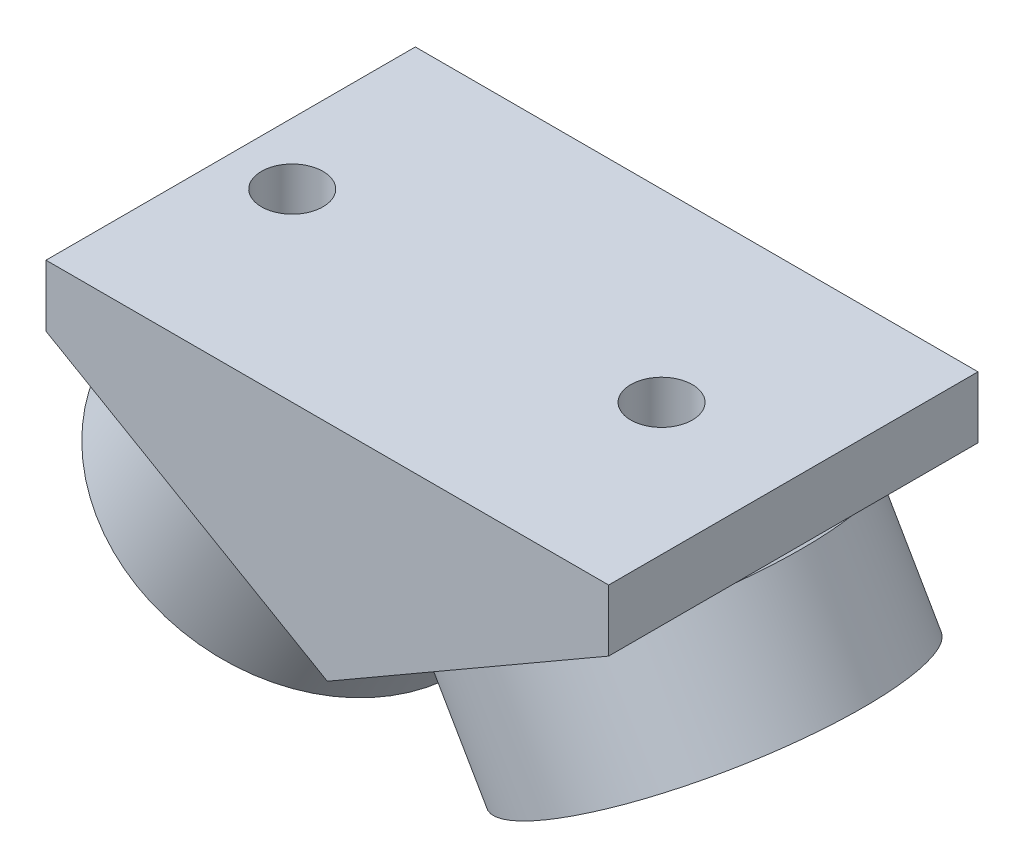
ISO-10303-21;
HEADER;
FILE_DESCRIPTION(('STEP AP214'),'2;1');
FILE_NAME('part.step','',(''),(''),'','','');
FILE_SCHEMA(('AUTOMOTIVE_DESIGN { 1 0 10303 214 1 1 1 1 }'));
ENDSEC;
DATA;
#1=APPLICATION_CONTEXT('core data for automotive mechanical design processes');
#2=APPLICATION_PROTOCOL_DEFINITION('international standard','automotive_design',2000,#1);
#3=PRODUCT_CONTEXT('',#1,'mechanical');
#4=PRODUCT('Part','Part','',(#3));
#5=PRODUCT_RELATED_PRODUCT_CATEGORY('part','',(#4));
#6=PRODUCT_DEFINITION_FORMATION('','',#4);
#7=PRODUCT_DEFINITION_CONTEXT('part definition',#1,'design');
#8=PRODUCT_DEFINITION('design','',#6,#7);
#9=PRODUCT_DEFINITION_SHAPE('','',#8);
#10=(LENGTH_UNIT() NAMED_UNIT(*) SI_UNIT(.MILLI.,.METRE.));
#11=(NAMED_UNIT(*) PLANE_ANGLE_UNIT() SI_UNIT($,.RADIAN.));
#12=(NAMED_UNIT(*) SI_UNIT($,.STERADIAN.) SOLID_ANGLE_UNIT());
#13=UNCERTAINTY_MEASURE_WITH_UNIT(LENGTH_MEASURE(1.E-05),#10,'distance_accuracy_value','');
#14=(GEOMETRIC_REPRESENTATION_CONTEXT(3) GLOBAL_UNCERTAINTY_ASSIGNED_CONTEXT((#13)) GLOBAL_UNIT_ASSIGNED_CONTEXT((#10,
#11,#12)) REPRESENTATION_CONTEXT('',''));
#15=CARTESIAN_POINT('',(0.,0.,0.));
#16=DIRECTION('',(0.,0.,1.));
#17=DIRECTION('',(1.,0.,0.));
#18=AXIS2_PLACEMENT_3D('',#15,#16,#17);
#19=CARTESIAN_POINT('',(0.,0.,38.1));
#20=DIRECTION('',(-0.500000000000003,0.866025403784437,0.));
#21=DIRECTION('',(-0.866025403784437,-0.500000000000003,0.));
#22=AXIS2_PLACEMENT_3D('',#19,#20,#21);
#23=PLANE('',#22);
#24=DIRECTION('',(0.,0.,-1.));
#25=VECTOR('',#24,1.);
#26=CARTESIAN_POINT('',(0.,0.,38.1));
#27=LINE('',#26,#25);
#28=CARTESIAN_POINT('',(0.,0.,38.1));
#29=VERTEX_POINT('',#28);
#30=CARTESIAN_POINT('',(0.,0.,24.9973690930889));
#31=VERTEX_POINT('',#30);
#32=EDGE_CURVE('E126',#29,#31,#27,.T.);
#33=ORIENTED_EDGE('',*,*,#32,.T.);
#34=CARTESIAN_POINT('',(14.5109579509048,8.3779054791543,19.05));
#35=DIRECTION('',(-0.500000000000003,0.866025403784437,0.));
#36=DIRECTION('',(-0.866025403784437,-0.500000000000003,0.));
#37=AXIS2_PLACEMENT_3D('',#34,#35,#36);
#38=CIRCLE('',#37,17.78);
#39=CARTESIAN_POINT('',(29.0219159018097,16.7558109583086,24.9973690930887));
#40=VERTEX_POINT('',#39);
#41=EDGE_CURVE('E185',#31,#40,#38,.T.);
#42=ORIENTED_EDGE('',*,*,#41,.T.);
#43=DIRECTION('',(0.,0.,-1.));
#44=VECTOR('',#43,1.);
#45=CARTESIAN_POINT('',(29.0219159018097,16.7558109583086,38.1));
#46=LINE('',#45,#44);
#47=CARTESIAN_POINT('',(29.0219159018097,16.7558109583086,38.1));
#48=VERTEX_POINT('',#47);
#49=EDGE_CURVE('E130',#48,#40,#46,.T.);
#50=ORIENTED_EDGE('',*,*,#49,.F.);
#51=DIRECTION('',(0.866025403784437,0.500000000000003,0.));
#52=VECTOR('',#51,1.);
#53=CARTESIAN_POINT('',(0.,0.,38.1));
#54=LINE('',#53,#52);
#55=EDGE_CURVE('E166',#29,#48,#54,.T.);
#56=ORIENTED_EDGE('',*,*,#55,.F.);
#57=EDGE_LOOP('',(#33,#42,#50,#56));
#58=FACE_BOUND('',#57,.T.);
#59=ADVANCED_FACE('F33',(#58),#23,.F.);
#60=CARTESIAN_POINT('',(-29.0219159018097,16.7558109583085,38.1));
#61=DIRECTION('',(0.500000000000001,0.866025403784438,0.));
#62=DIRECTION('',(-0.866025403784438,0.500000000000001,0.));
#63=AXIS2_PLACEMENT_3D('',#60,#61,#62);
#64=PLANE('',#63);
#65=CARTESIAN_POINT('',(-14.5109579509048,8.37790547915427,19.05));
#66=DIRECTION('',(-0.500000000000001,-0.866025403784438,0.));
#67=DIRECTION('',(0.866025403784438,-0.500000000000001,0.));
#68=AXIS2_PLACEMENT_3D('',#65,#66,#67);
#69=CIRCLE('',#68,17.78);
#70=CARTESIAN_POINT('',(-29.0219159018097,16.7558109583085,24.9973690930888));
#71=VERTEX_POINT('',#70);
#72=EDGE_CURVE('E170',#31,#71,#69,.T.);
#73=ORIENTED_EDGE('',*,*,#72,.F.);
#74=ORIENTED_EDGE('',*,*,#32,.F.);
#75=DIRECTION('',(0.866025403784438,-0.500000000000001,0.));
#76=VECTOR('',#75,1.);
#77=CARTESIAN_POINT('',(-29.0219159018097,16.7558109583085,38.1));
#78=LINE('',#77,#76);
#79=CARTESIAN_POINT('',(-29.0219159018097,16.7558109583085,38.1));
#80=VERTEX_POINT('',#79);
#81=EDGE_CURVE('E148',#80,#29,#78,.T.);
#82=ORIENTED_EDGE('',*,*,#81,.F.);
#83=DIRECTION('',(0.,0.,-1.));
#84=VECTOR('',#83,1.);
#85=CARTESIAN_POINT('',(-29.0219159018097,16.7558109583085,38.1));
#86=LINE('',#85,#84);
#87=EDGE_CURVE('E140',#80,#71,#86,.T.);
#88=ORIENTED_EDGE('',*,*,#87,.T.);
#89=EDGE_LOOP('',(#73,#74,#82,#88));
#90=FACE_BOUND('',#89,.T.);
#91=ADVANCED_FACE('F214',(#90),#64,.F.);
#92=CARTESIAN_POINT('',(-29.0219159018097,16.7558109583085,13.1026309069112));
#93=VERTEX_POINT('',#92);
#94=CARTESIAN_POINT('',(0.,0.,13.1026309069111));
#95=VERTEX_POINT('',#94);
#96=EDGE_CURVE('E56',#93,#95,#69,.T.);
#97=ORIENTED_EDGE('',*,*,#96,.F.);
#98=CARTESIAN_POINT('',(-29.0219159018097,16.7558109583085,0.));
#99=VERTEX_POINT('',#98);
#100=EDGE_CURVE('E144',#93,#99,#86,.T.);
#101=ORIENTED_EDGE('',*,*,#100,.T.);
#102=DIRECTION('',(0.866025403784438,-0.500000000000001,0.));
#103=VECTOR('',#102,1.);
#104=CARTESIAN_POINT('',(-29.0219159018097,16.7558109583085,0.));
#105=LINE('',#104,#103);
#106=CARTESIAN_POINT('',(0.,0.,0.));
#107=VERTEX_POINT('',#106);
#108=EDGE_CURVE('E156',#99,#107,#105,.T.);
#109=ORIENTED_EDGE('',*,*,#108,.T.);
#110=EDGE_CURVE('E129',#95,#107,#27,.T.);
#111=ORIENTED_EDGE('',*,*,#110,.F.);
#112=EDGE_LOOP('',(#97,#101,#109,#111));
#113=FACE_BOUND('',#112,.T.);
#114=ADVANCED_FACE('F35',(#113),#64,.F.);
#115=CARTESIAN_POINT('',(29.0219159018097,16.7558109583086,13.1026309069113));
#116=VERTEX_POINT('',#115);
#117=CARTESIAN_POINT('',(29.0219159018097,16.7558109583086,0.));
#118=VERTEX_POINT('',#117);
#119=EDGE_CURVE('E133',#116,#118,#46,.T.);
#120=ORIENTED_EDGE('',*,*,#119,.F.);
#121=EDGE_CURVE('E189',#116,#95,#38,.T.);
#122=ORIENTED_EDGE('',*,*,#121,.T.);
#123=ORIENTED_EDGE('',*,*,#110,.T.);
#124=DIRECTION('',(0.866025403784437,0.500000000000003,0.));
#125=VECTOR('',#124,1.);
#126=CARTESIAN_POINT('',(0.,0.,0.));
#127=LINE('',#126,#125);
#128=EDGE_CURVE('E153',#107,#118,#127,.T.);
#129=ORIENTED_EDGE('',*,*,#128,.T.);
#130=EDGE_LOOP('',(#120,#122,#123,#129));
#131=FACE_BOUND('',#130,.T.);
#132=ADVANCED_FACE('F117',(#131),#23,.F.);
#133=CARTESIAN_POINT('',(29.0219159018097,23.1058109583085,38.1));
#134=DIRECTION('',(-1.,0.,0.));
#135=DIRECTION('',(0.,-1.,0.));
#136=AXIS2_PLACEMENT_3D('',#133,#134,#135);
#137=PLANE('',#136);
#138=DIRECTION('',(0.,1.,0.));
#139=VECTOR('',#138,1.);
#140=CARTESIAN_POINT('',(29.0219159018097,23.1058109583085,0.));
#141=LINE('',#140,#139);
#142=CARTESIAN_POINT('',(29.0219159018097,23.1058109583085,0.));
#143=VERTEX_POINT('',#142);
#144=EDGE_CURVE('E151',#118,#143,#141,.T.);
#145=ORIENTED_EDGE('',*,*,#144,.T.);
#146=DIRECTION('',(0.,0.,-1.));
#147=VECTOR('',#146,1.);
#148=CARTESIAN_POINT('',(29.0219159018097,23.1058109583085,38.1));
#149=LINE('',#148,#147);
#150=CARTESIAN_POINT('',(29.0219159018097,23.1058109583085,38.1));
#151=VERTEX_POINT('',#150);
#152=EDGE_CURVE('E134',#151,#143,#149,.T.);
#153=ORIENTED_EDGE('',*,*,#152,.F.);
#154=DIRECTION('',(0.,1.,0.));
#155=VECTOR('',#154,1.);
#156=CARTESIAN_POINT('',(29.0219159018097,23.1058109583085,38.1));
#157=LINE('',#156,#155);
#158=EDGE_CURVE('E164',#48,#151,#157,.T.);
#159=ORIENTED_EDGE('',*,*,#158,.F.);
#160=ORIENTED_EDGE('',*,*,#49,.T.);
#161=DIRECTION('',(0.,0.,1.));
#162=VECTOR('',#161,1.);
#163=CARTESIAN_POINT('',(29.0219159018097,16.7558109583086,38.1));
#164=LINE('',#163,#162);
#165=EDGE_CURVE('E180',#116,#40,#164,.T.);
#166=ORIENTED_EDGE('',*,*,#165,.F.);
#167=ORIENTED_EDGE('',*,*,#119,.T.);
#168=EDGE_LOOP('',(#145,#153,#159,#160,#166,#167));
#169=FACE_BOUND('',#168,.T.);
#170=ADVANCED_FACE('F222',(#169),#137,.F.);
#171=CARTESIAN_POINT('',(-29.0219159018097,23.1058109583085,38.1));
#172=DIRECTION('',(0.,-1.,0.));
#173=DIRECTION('',(0.,0.,-1.));
#174=AXIS2_PLACEMENT_3D('',#171,#172,#173);
#175=PLANE('',#174);
#176=CARTESIAN_POINT('',(-22.6719159018097,23.1058109583085,19.05));
#177=DIRECTION('',(0.,1.,0.));
#178=DIRECTION('',(0.,0.,1.));
#179=AXIS2_PLACEMENT_3D('',#176,#177,#178);
#180=CIRCLE('',#179,3.175);
#181=CARTESIAN_POINT('',(-22.6719159018097,23.1058109583085,22.225));
#182=VERTEX_POINT('',#181);
#183=EDGE_CURVE('E110',#182,#182,#180,.T.);
#184=ORIENTED_EDGE('',*,*,#183,.F.);
#185=EDGE_LOOP('',(#184));
#186=FACE_BOUND('',#185,.T.);
#187=CARTESIAN_POINT('',(15.4280840981903,23.1058109583085,19.05));
#188=DIRECTION('',(0.,1.,0.));
#189=DIRECTION('',(0.,0.,1.));
#190=AXIS2_PLACEMENT_3D('',#187,#188,#189);
#191=CIRCLE('',#190,3.175);
#192=CARTESIAN_POINT('',(15.4280840981903,23.1058109583085,22.225));
#193=VERTEX_POINT('',#192);
#194=EDGE_CURVE('E111',#193,#193,#191,.T.);
#195=ORIENTED_EDGE('',*,*,#194,.F.);
#196=EDGE_LOOP('',(#195));
#197=FACE_BOUND('',#196,.T.);
#198=DIRECTION('',(-1.,0.,0.));
#199=VECTOR('',#198,1.);
#200=CARTESIAN_POINT('',(-29.0219159018097,23.1058109583085,0.));
#201=LINE('',#200,#199);
#202=CARTESIAN_POINT('',(-29.0219159018097,23.1058109583085,0.));
#203=VERTEX_POINT('',#202);
#204=EDGE_CURVE('E149',#143,#203,#201,.T.);
#205=ORIENTED_EDGE('',*,*,#204,.T.);
#206=DIRECTION('',(0.,0.,-1.));
#207=VECTOR('',#206,1.);
#208=CARTESIAN_POINT('',(-29.0219159018097,23.1058109583085,38.1));
#209=LINE('',#208,#207);
#210=CARTESIAN_POINT('',(-29.0219159018097,23.1058109583085,38.1));
#211=VERTEX_POINT('',#210);
#212=EDGE_CURVE('E137',#211,#203,#209,.T.);
#213=ORIENTED_EDGE('',*,*,#212,.F.);
#214=DIRECTION('',(-1.,0.,0.));
#215=VECTOR('',#214,1.);
#216=CARTESIAN_POINT('',(-29.0219159018097,23.1058109583085,38.1));
#217=LINE('',#216,#215);
#218=EDGE_CURVE('E162',#151,#211,#217,.T.);
#219=ORIENTED_EDGE('',*,*,#218,.F.);
#220=ORIENTED_EDGE('',*,*,#152,.T.);
#221=EDGE_LOOP('',(#205,#213,#219,#220));
#222=FACE_BOUND('',#221,.T.);
#223=ADVANCED_FACE('F228',(#186,#197,#222),#175,.F.);
#224=CARTESIAN_POINT('',(-29.0219159018097,16.7558109583085,38.1));
#225=DIRECTION('',(1.,0.,0.));
#226=DIRECTION('',(0.,0.,-1.));
#227=AXIS2_PLACEMENT_3D('',#224,#225,#226);
#228=PLANE('',#227);
#229=DIRECTION('',(0.,-1.,0.));
#230=VECTOR('',#229,1.);
#231=CARTESIAN_POINT('',(-29.0219159018097,16.7558109583085,0.));
#232=LINE('',#231,#230);
#233=EDGE_CURVE('E145',#203,#99,#232,.T.);
#234=ORIENTED_EDGE('',*,*,#233,.T.);
#235=ORIENTED_EDGE('',*,*,#100,.F.);
#236=EDGE_CURVE('E143',#71,#93,#86,.T.);
#237=ORIENTED_EDGE('',*,*,#236,.F.);
#238=ORIENTED_EDGE('',*,*,#87,.F.);
#239=DIRECTION('',(0.,-1.,0.));
#240=VECTOR('',#239,1.);
#241=CARTESIAN_POINT('',(-29.0219159018097,16.7558109583085,38.1));
#242=LINE('',#241,#240);
#243=EDGE_CURVE('E160',#211,#80,#242,.T.);
#244=ORIENTED_EDGE('',*,*,#243,.F.);
#245=ORIENTED_EDGE('',*,*,#212,.T.);
#246=EDGE_LOOP('',(#234,#235,#237,#238,#244,#245));
#247=FACE_BOUND('',#246,.T.);
#248=ADVANCED_FACE('F257',(#247),#228,.F.);
#249=CARTESIAN_POINT('',(0.,0.,38.1));
#250=DIRECTION('',(0.,0.,1.));
#251=DIRECTION('',(1.,0.,0.));
#252=AXIS2_PLACEMENT_3D('',#249,#250,#251);
#253=PLANE('',#252);
#254=ORIENTED_EDGE('',*,*,#81,.T.);
#255=ORIENTED_EDGE('',*,*,#55,.T.);
#256=ORIENTED_EDGE('',*,*,#158,.T.);
#257=ORIENTED_EDGE('',*,*,#218,.T.);
#258=ORIENTED_EDGE('',*,*,#243,.T.);
#259=EDGE_LOOP('',(#254,#255,#256,#257,#258));
#260=FACE_BOUND('',#259,.T.);
#261=ADVANCED_FACE('F267',(#260),#253,.T.);
#262=CARTESIAN_POINT('',(0.,0.,0.));
#263=DIRECTION('',(0.,0.,1.));
#264=DIRECTION('',(1.,0.,0.));
#265=AXIS2_PLACEMENT_3D('',#262,#263,#264);
#266=PLANE('',#265);
#267=ORIENTED_EDGE('',*,*,#108,.F.);
#268=ORIENTED_EDGE('',*,*,#233,.F.);
#269=ORIENTED_EDGE('',*,*,#204,.F.);
#270=ORIENTED_EDGE('',*,*,#144,.F.);
#271=ORIENTED_EDGE('',*,*,#128,.F.);
#272=EDGE_LOOP('',(#267,#268,#269,#270,#271));
#273=FACE_BOUND('',#272,.T.);
#274=ADVANCED_FACE('F262',(#273),#266,.F.);
#275=CARTESIAN_POINT('',(-14.5109579509048,8.37790547915427,19.05));
#276=DIRECTION('',(-0.500000000000001,-0.866025403784438,0.));
#277=DIRECTION('',(0.866025403784438,-0.500000000000001,0.));
#278=AXIS2_PLACEMENT_3D('',#275,#276,#277);
#279=PLANE('',#278);
#280=EDGE_CURVE('E173',#71,#93,#69,.T.);
#281=ORIENTED_EDGE('',*,*,#280,.F.);
#282=ORIENTED_EDGE('',*,*,#236,.T.);
#283=EDGE_LOOP('',(#281,#282));
#284=FACE_BOUND('',#283,.T.);
#285=ADVANCED_FACE('F253',(#284),#279,.F.);
#286=CARTESIAN_POINT('',(-20.8609579509048,-2.62061714890809,19.05));
#287=DIRECTION('',(-0.500000000000001,-0.866025403784438,0.));
#288=DIRECTION('',(0.866025403784438,-0.500000000000001,0.));
#289=AXIS2_PLACEMENT_3D('',#286,#287,#288);
#290=PLANE('',#289);
#291=CARTESIAN_POINT('',(-20.8609579509048,-2.62061714890809,19.05));
#292=DIRECTION('',(-0.500000000000001,-0.866025403784438,0.));
#293=DIRECTION('',(0.866025403784438,-0.500000000000001,0.));
#294=AXIS2_PLACEMENT_3D('',#291,#292,#293);
#295=CIRCLE('',#294,17.78);
#296=CARTESIAN_POINT('',(-5.46302627161754,-11.5106171489081,19.05));
#297=VERTEX_POINT('',#296);
#298=EDGE_CURVE('E159',#297,#297,#295,.T.);
#299=ORIENTED_EDGE('',*,*,#298,.T.);
#300=EDGE_LOOP('',(#299));
#301=FACE_BOUND('',#300,.T.);
#302=CARTESIAN_POINT('',(-20.8609579509048,-2.62061714890809,19.05));
#303=DIRECTION('',(-0.500000000000001,-0.866025403784438,0.));
#304=DIRECTION('',(0.866025403784438,-0.500000000000001,0.));
#305=AXIS2_PLACEMENT_3D('',#302,#303,#304);
#306=CIRCLE('',#305,13.97);
#307=CARTESIAN_POINT('',(-8.76258306003625,-9.60561714890811,19.05));
#308=VERTEX_POINT('',#307);
#309=EDGE_CURVE('E179',#308,#308,#306,.T.);
#310=ORIENTED_EDGE('',*,*,#309,.F.);
#311=EDGE_LOOP('',(#310));
#312=FACE_BOUND('',#311,.T.);
#313=ADVANCED_FACE('F307',(#301,#312),#290,.T.);
#314=CARTESIAN_POINT('',(-20.8609579509048,-2.62061714890809,19.05));
#315=DIRECTION('',(0.500000000000001,0.866025403784438,0.));
#316=DIRECTION('',(-0.866025403784438,0.500000000000001,0.));
#317=AXIS2_PLACEMENT_3D('',#314,#315,#316);
#318=CYLINDRICAL_SURFACE('',#317,17.78);
#319=ORIENTED_EDGE('',*,*,#298,.F.);
#320=EDGE_LOOP('',(#319));
#321=FACE_BOUND('',#320,.T.);
#322=ORIENTED_EDGE('',*,*,#96,.T.);
#323=CARTESIAN_POINT('',(0.,33.5116219166169,19.05));
#324=DIRECTION('',(1.,0.,0.));
#325=DIRECTION('',(0.,1.,0.));
#326=AXIS2_PLACEMENT_3D('',#323,#324,#325);
#327=ELLIPSE('',#326,35.5599999999999,17.78);
#328=EDGE_CURVE('E121',#95,#31,#327,.F.);
#329=ORIENTED_EDGE('',*,*,#328,.T.);
#330=ORIENTED_EDGE('',*,*,#72,.T.);
#331=ORIENTED_EDGE('',*,*,#280,.T.);
#332=EDGE_LOOP('',(#322,#329,#330,#331));
#333=FACE_BOUND('',#332,.T.);
#334=ADVANCED_FACE('F250',(#321,#333),#318,.T.);
#335=CARTESIAN_POINT('',(-20.8609579509048,-2.62061714890809,19.05));
#336=DIRECTION('',(0.500000000000001,0.866025403784438,0.));
#337=DIRECTION('',(-0.866025403784438,0.500000000000001,0.));
#338=AXIS2_PLACEMENT_3D('',#335,#336,#337);
#339=CYLINDRICAL_SURFACE('',#338,13.97);
#340=ORIENTED_EDGE('',*,*,#309,.T.);
#341=EDGE_LOOP('',(#340));
#342=FACE_BOUND('',#341,.T.);
#343=CARTESIAN_POINT('',(-14.5109579509048,8.37790547915427,19.05));
#344=DIRECTION('',(-0.500000000000001,-0.866025403784438,0.));
#345=DIRECTION('',(0.866025403784438,-0.500000000000001,0.));
#346=AXIS2_PLACEMENT_3D('',#343,#344,#345);
#347=CIRCLE('',#346,13.97);
#348=CARTESIAN_POINT('',(-2.41258306003623,1.39290547915425,19.05));
#349=VERTEX_POINT('',#348);
#350=EDGE_CURVE('E176',#349,#349,#347,.T.);
#351=ORIENTED_EDGE('',*,*,#350,.F.);
#352=EDGE_LOOP('',(#351));
#353=FACE_BOUND('',#352,.T.);
#354=ADVANCED_FACE('F303',(#342,#353),#339,.F.);
#355=CARTESIAN_POINT('',(-22.6719159018097,13.0896367489544,19.05));
#356=DIRECTION('',(0.500000000000001,0.866025403784438,0.));
#357=DIRECTION('',(-0.866025403784438,0.500000000000001,0.));
#358=AXIS2_PLACEMENT_3D('',#355,#356,#357);
#359=ELLIPSE('',#358,3.66617420935413,3.175);
#360=CARTESIAN_POINT('',(-25.8469159018097,14.9227238536315,19.05));
#361=VERTEX_POINT('',#360);
#362=EDGE_CURVE('E37',#361,#361,#359,.T.);
#363=ORIENTED_EDGE('',*,*,#362,.T.);
#364=EDGE_LOOP('',(#363));
#365=FACE_BOUND('',#364,.T.);
#366=ORIENTED_EDGE('',*,*,#350,.T.);
#367=EDGE_LOOP('',(#366));
#368=FACE_BOUND('',#367,.T.);
#369=ADVANCED_FACE('F203',(#365,#368),#64,.F.);
#370=CARTESIAN_POINT('',(20.8609579509049,-2.62061714890805,19.05));
#371=DIRECTION('',(-0.500000000000003,0.866025403784437,0.));
#372=DIRECTION('',(-0.866025403784437,-0.500000000000003,0.));
#373=AXIS2_PLACEMENT_3D('',#370,#371,#372);
#374=CYLINDRICAL_SURFACE('',#373,17.78);
#375=CARTESIAN_POINT('',(20.8609579509049,-2.62061714890805,19.05));
#376=DIRECTION('',(-0.500000000000003,0.866025403784437,0.));
#377=DIRECTION('',(-0.866025403784437,-0.500000000000003,0.));
#378=AXIS2_PLACEMENT_3D('',#375,#376,#377);
#379=CIRCLE('',#378,17.78);
#380=CARTESIAN_POINT('',(5.46302627161756,-11.5106171489081,19.05));
#381=VERTEX_POINT('',#380);
#382=EDGE_CURVE('E184',#381,#381,#379,.T.);
#383=ORIENTED_EDGE('',*,*,#382,.T.);
#384=EDGE_LOOP('',(#383));
#385=FACE_BOUND('',#384,.T.);
#386=ORIENTED_EDGE('',*,*,#328,.F.);
#387=ORIENTED_EDGE('',*,*,#121,.F.);
#388=EDGE_CURVE('E188',#40,#116,#38,.T.);
#389=ORIENTED_EDGE('',*,*,#388,.F.);
#390=ORIENTED_EDGE('',*,*,#41,.F.);
#391=EDGE_LOOP('',(#386,#387,#389,#390));
#392=FACE_BOUND('',#391,.T.);
#393=ADVANCED_FACE('F242',(#385,#392),#374,.T.);
#394=CARTESIAN_POINT('',(20.8609579509049,-2.62061714890805,19.05));
#395=DIRECTION('',(0.500000000000003,-0.866025403784437,0.));
#396=DIRECTION('',(-0.866025403784437,-0.500000000000003,0.));
#397=AXIS2_PLACEMENT_3D('',#394,#395,#396);
#398=PLANE('',#397);
#399=CARTESIAN_POINT('',(20.8609579509049,-2.62061714890805,19.05));
#400=DIRECTION('',(-0.500000000000003,0.866025403784437,0.));
#401=DIRECTION('',(-0.866025403784437,-0.500000000000003,0.));
#402=AXIS2_PLACEMENT_3D('',#399,#400,#401);
#403=CIRCLE('',#402,13.97);
#404=CARTESIAN_POINT('',(8.76258306003626,-9.60561714890809,19.05));
#405=VERTEX_POINT('',#404);
#406=EDGE_CURVE('E192',#405,#405,#403,.T.);
#407=ORIENTED_EDGE('',*,*,#406,.T.);
#408=EDGE_LOOP('',(#407));
#409=FACE_BOUND('',#408,.T.);
#410=ORIENTED_EDGE('',*,*,#382,.F.);
#411=EDGE_LOOP('',(#410));
#412=FACE_BOUND('',#411,.T.);
#413=ADVANCED_FACE('F294',(#409,#412),#398,.T.);
#414=CARTESIAN_POINT('',(14.5109579509048,8.3779054791543,19.05));
#415=DIRECTION('',(0.500000000000003,-0.866025403784437,0.));
#416=DIRECTION('',(-0.866025403784437,-0.500000000000003,0.));
#417=AXIS2_PLACEMENT_3D('',#414,#415,#416);
#418=PLANE('',#417);
#419=ORIENTED_EDGE('',*,*,#388,.T.);
#420=ORIENTED_EDGE('',*,*,#165,.T.);
#421=EDGE_LOOP('',(#419,#420));
#422=FACE_BOUND('',#421,.T.);
#423=ADVANCED_FACE('F240',(#422),#418,.F.);
#424=CARTESIAN_POINT('',(20.8609579509049,-2.62061714890805,19.05));
#425=DIRECTION('',(-0.500000000000003,0.866025403784437,0.));
#426=DIRECTION('',(-0.866025403784437,-0.500000000000003,0.));
#427=AXIS2_PLACEMENT_3D('',#424,#425,#426);
#428=CYLINDRICAL_SURFACE('',#427,13.97);
#429=ORIENTED_EDGE('',*,*,#406,.F.);
#430=EDGE_LOOP('',(#429));
#431=FACE_BOUND('',#430,.T.);
#432=CARTESIAN_POINT('',(14.5109579509048,8.3779054791543,19.05));
#433=DIRECTION('',(-0.500000000000003,0.866025403784437,0.));
#434=DIRECTION('',(-0.866025403784437,-0.500000000000003,0.));
#435=AXIS2_PLACEMENT_3D('',#432,#433,#434);
#436=CIRCLE('',#435,13.97);
#437=CARTESIAN_POINT('',(2.41258306003623,1.39290547915426,19.05));
#438=VERTEX_POINT('',#437);
#439=EDGE_CURVE('E106',#438,#438,#436,.T.);
#440=ORIENTED_EDGE('',*,*,#439,.T.);
#441=EDGE_LOOP('',(#440));
#442=FACE_BOUND('',#441,.T.);
#443=ADVANCED_FACE('F116',(#431,#442),#428,.F.);
#444=DIRECTION('',(0.,0.,-1.));
#445=VECTOR('',#444,1.);
#446=CARTESIAN_POINT('',(18.0233932737473,10.4058109583085,38.1));
#447=LINE('',#446,#445);
#448=CARTESIAN_POINT('',(18.0233932737473,10.4058109583085,20.8789328263416));
#449=VERTEX_POINT('',#448);
#450=CARTESIAN_POINT('',(18.0233932737473,10.4058109583085,17.2210671736584));
#451=VERTEX_POINT('',#450);
#452=EDGE_CURVE('E42',#449,#451,#447,.T.);
#453=ORIENTED_EDGE('',*,*,#452,.F.);
#454=CARTESIAN_POINT('',(15.4280840981903,8.90740850717044,19.05));
#455=DIRECTION('',(-0.500000000000003,0.866025403784437,0.));
#456=DIRECTION('',(0.866025403784437,0.500000000000003,0.));
#457=AXIS2_PLACEMENT_3D('',#454,#455,#456);
#458=ELLIPSE('',#457,3.66617420935413,3.175);
#459=EDGE_CURVE('E11',#449,#451,#458,.T.);
#460=ORIENTED_EDGE('',*,*,#459,.T.);
#461=EDGE_LOOP('',(#453,#460));
#462=FACE_BOUND('',#461,.T.);
#463=ORIENTED_EDGE('',*,*,#439,.F.);
#464=EDGE_LOOP('',(#463));
#465=FACE_BOUND('',#464,.T.);
#466=ADVANCED_FACE('F113',(#462,#465),#23,.F.);
#467=CARTESIAN_POINT('',(15.4280840981903,10.4058109583085,19.05));
#468=DIRECTION('',(0.,1.,0.));
#469=DIRECTION('',(0.,0.,1.));
#470=AXIS2_PLACEMENT_3D('',#467,#468,#469);
#471=CYLINDRICAL_SURFACE('',#470,3.175);
#472=ORIENTED_EDGE('',*,*,#194,.T.);
#473=EDGE_LOOP('',(#472));
#474=FACE_BOUND('',#473,.T.);
#475=CARTESIAN_POINT('',(15.4280840981903,10.4058109583085,19.05));
#476=DIRECTION('',(0.,1.,0.));
#477=DIRECTION('',(0.,0.,1.));
#478=AXIS2_PLACEMENT_3D('',#475,#476,#477);
#479=CIRCLE('',#478,3.175);
#480=EDGE_CURVE('E48',#451,#449,#479,.T.);
#481=ORIENTED_EDGE('',*,*,#480,.F.);
#482=ORIENTED_EDGE('',*,*,#459,.F.);
#483=EDGE_LOOP('',(#481,#482));
#484=FACE_BOUND('',#483,.T.);
#485=ADVANCED_FACE('F109',(#474,#484),#471,.F.);
#486=CARTESIAN_POINT('',(15.4280840981903,10.4058109583085,19.05));
#487=DIRECTION('',(0.,1.,0.));
#488=DIRECTION('',(0.,0.,1.));
#489=AXIS2_PLACEMENT_3D('',#486,#487,#488);
#490=PLANE('',#489);
#491=ORIENTED_EDGE('',*,*,#452,.T.);
#492=ORIENTED_EDGE('',*,*,#480,.T.);
#493=EDGE_LOOP('',(#491,#492));
#494=FACE_BOUND('',#493,.T.);
#495=ADVANCED_FACE('F104',(#494),#490,.T.);
#496=CARTESIAN_POINT('',(-22.6719159018097,10.4058109583085,19.05));
#497=DIRECTION('',(0.,1.,0.));
#498=DIRECTION('',(0.,0.,1.));
#499=AXIS2_PLACEMENT_3D('',#496,#497,#498);
#500=CYLINDRICAL_SURFACE('',#499,3.175);
#501=ORIENTED_EDGE('',*,*,#183,.T.);
#502=EDGE_LOOP('',(#501));
#503=FACE_BOUND('',#502,.T.);
#504=ORIENTED_EDGE('',*,*,#362,.F.);
#505=EDGE_LOOP('',(#504));
#506=FACE_BOUND('',#505,.T.);
#507=ADVANCED_FACE('F206',(#503,#506),#500,.F.);
#508=CLOSED_SHELL('',(#59,#91,#114,#132,#170,#223,#248,#261,#274,#285,#313,#334,#354,#369,#393,
#413,#423,#443,#466,#485,#495,#507));
#509=MANIFOLD_SOLID_BREP('B2',#508);
#510=ADVANCED_BREP_SHAPE_REPRESENTATION('',(#18,#509),#14);
#511=SHAPE_DEFINITION_REPRESENTATION(#9,#510);
ENDSEC;
END-ISO-10303-21;
